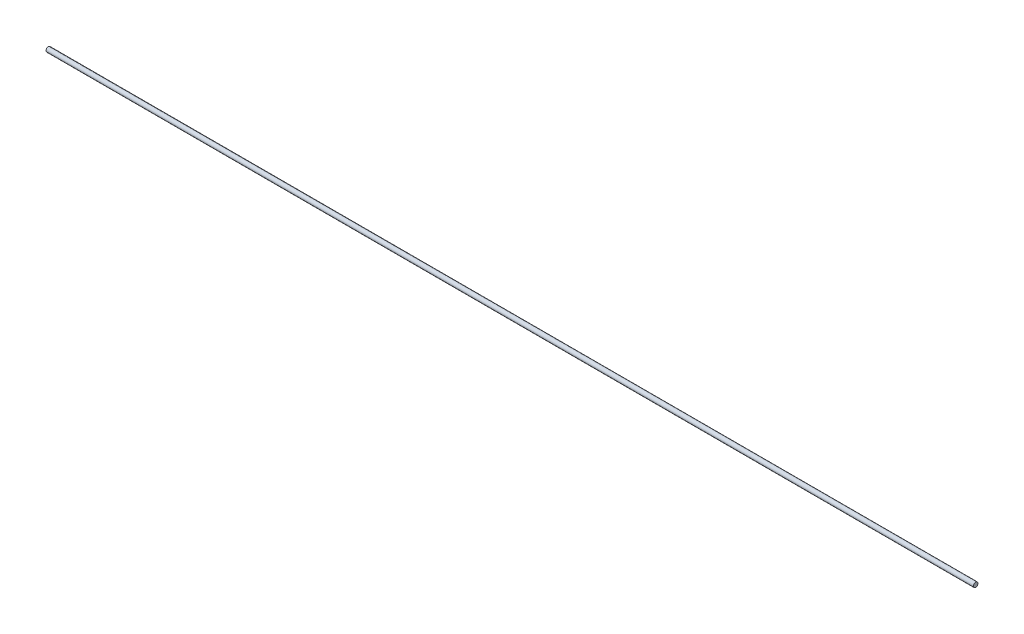
ISO-10303-21;
HEADER;
FILE_DESCRIPTION(('STEP AP214'),'2;1');
FILE_NAME('part.step','',(''),(''),'','','');
FILE_SCHEMA(('AUTOMOTIVE_DESIGN { 1 0 10303 214 1 1 1 1 }'));
ENDSEC;
DATA;
#1=APPLICATION_CONTEXT('core data for automotive mechanical design processes');
#2=APPLICATION_PROTOCOL_DEFINITION('international standard','automotive_design',2000,#1);
#3=PRODUCT_CONTEXT('',#1,'mechanical');
#4=PRODUCT('Part','Part','',(#3));
#5=PRODUCT_RELATED_PRODUCT_CATEGORY('part','',(#4));
#6=PRODUCT_DEFINITION_FORMATION('','',#4);
#7=PRODUCT_DEFINITION_CONTEXT('part definition',#1,'design');
#8=PRODUCT_DEFINITION('design','',#6,#7);
#9=PRODUCT_DEFINITION_SHAPE('','',#8);
#10=(LENGTH_UNIT() NAMED_UNIT(*) SI_UNIT(.MILLI.,.METRE.));
#11=(NAMED_UNIT(*) PLANE_ANGLE_UNIT() SI_UNIT($,.RADIAN.));
#12=(NAMED_UNIT(*) SI_UNIT($,.STERADIAN.) SOLID_ANGLE_UNIT());
#13=UNCERTAINTY_MEASURE_WITH_UNIT(LENGTH_MEASURE(1.E-05),#10,'distance_accuracy_value','');
#14=(GEOMETRIC_REPRESENTATION_CONTEXT(3) GLOBAL_UNCERTAINTY_ASSIGNED_CONTEXT((#13)) GLOBAL_UNIT_ASSIGNED_CONTEXT((#10,
#11,#12)) REPRESENTATION_CONTEXT('',''));
#15=CARTESIAN_POINT('',(0.,0.,0.));
#16=DIRECTION('',(0.,0.,1.));
#17=DIRECTION('',(1.,0.,0.));
#18=AXIS2_PLACEMENT_3D('',#15,#16,#17);
#19=CARTESIAN_POINT('',(200.,0.,0.));
#20=DIRECTION('',(-1.,0.,0.));
#21=DIRECTION('',(0.,0.,1.));
#22=AXIS2_PLACEMENT_3D('',#19,#20,#21);
#23=CYLINDRICAL_SURFACE('',#22,0.5);
#24=CARTESIAN_POINT('',(200.,0.,0.));
#25=DIRECTION('',(1.,0.,0.));
#26=DIRECTION('',(0.,0.,-1.));
#27=AXIS2_PLACEMENT_3D('',#24,#25,#26);
#28=CIRCLE('',#27,0.5);
#29=CARTESIAN_POINT('',(200.,0.,-0.5));
#30=VERTEX_POINT('',#29);
#31=EDGE_CURVE('E10',#30,#30,#28,.T.);
#32=ORIENTED_EDGE('',*,*,#31,.F.);
#33=EDGE_LOOP('',(#32));
#34=FACE_BOUND('',#33,.T.);
#35=CARTESIAN_POINT('',(0.,0.,0.));
#36=DIRECTION('',(1.,0.,0.));
#37=DIRECTION('',(0.,0.,-1.));
#38=AXIS2_PLACEMENT_3D('',#35,#36,#37);
#39=CIRCLE('',#38,0.5);
#40=CARTESIAN_POINT('',(0.,0.,-0.5));
#41=VERTEX_POINT('',#40);
#42=EDGE_CURVE('E39',#41,#41,#39,.T.);
#43=ORIENTED_EDGE('',*,*,#42,.T.);
#44=EDGE_LOOP('',(#43));
#45=FACE_BOUND('',#44,.T.);
#46=ADVANCED_FACE('F36',(#34,#45),#23,.T.);
#47=CARTESIAN_POINT('',(200.,0.,0.));
#48=DIRECTION('',(1.,0.,0.));
#49=DIRECTION('',(0.,0.,-1.));
#50=AXIS2_PLACEMENT_3D('',#47,#48,#49);
#51=PLANE('',#50);
#52=ORIENTED_EDGE('',*,*,#31,.T.);
#53=EDGE_LOOP('',(#52));
#54=FACE_BOUND('',#53,.T.);
#55=ADVANCED_FACE('F51',(#54),#51,.T.);
#56=CARTESIAN_POINT('',(0.,0.,0.));
#57=DIRECTION('',(1.,0.,0.));
#58=DIRECTION('',(0.,0.,-1.));
#59=AXIS2_PLACEMENT_3D('',#56,#57,#58);
#60=PLANE('',#59);
#61=ORIENTED_EDGE('',*,*,#42,.F.);
#62=EDGE_LOOP('',(#61));
#63=FACE_BOUND('',#62,.T.);
#64=ADVANCED_FACE('F49',(#63),#60,.F.);
#65=CLOSED_SHELL('',(#46,#55,#64));
#66=MANIFOLD_SOLID_BREP('B2',#65);
#67=ADVANCED_BREP_SHAPE_REPRESENTATION('',(#18,#66),#14);
#68=SHAPE_DEFINITION_REPRESENTATION(#9,#67);
ENDSEC;
END-ISO-10303-21;
